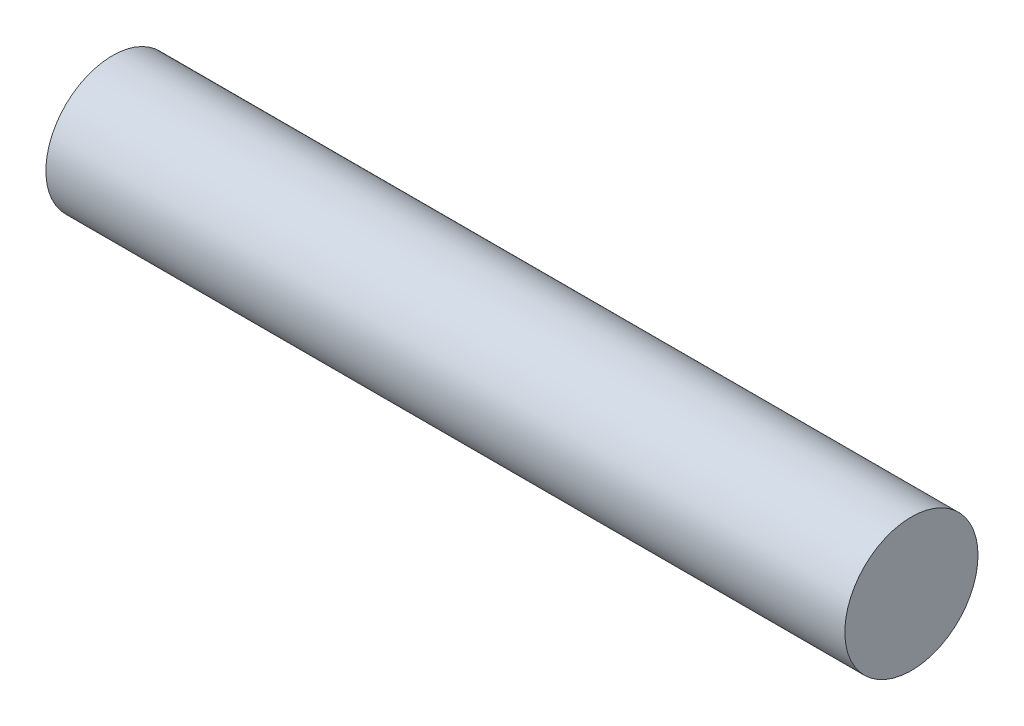
ISO-10303-21;
HEADER;
FILE_DESCRIPTION(('STEP AP214'),'2;1');
FILE_NAME('part.step','',(''),(''),'','','');
FILE_SCHEMA(('AUTOMOTIVE_DESIGN { 1 0 10303 214 1 1 1 1 }'));
ENDSEC;
DATA;
#1=APPLICATION_CONTEXT('core data for automotive mechanical design processes');
#2=APPLICATION_PROTOCOL_DEFINITION('international standard','automotive_design',2000,#1);
#3=PRODUCT_CONTEXT('',#1,'mechanical');
#4=PRODUCT('Part','Part','',(#3));
#5=PRODUCT_RELATED_PRODUCT_CATEGORY('part','',(#4));
#6=PRODUCT_DEFINITION_FORMATION('','',#4);
#7=PRODUCT_DEFINITION_CONTEXT('part definition',#1,'design');
#8=PRODUCT_DEFINITION('design','',#6,#7);
#9=PRODUCT_DEFINITION_SHAPE('','',#8);
#10=(LENGTH_UNIT() NAMED_UNIT(*) SI_UNIT(.MILLI.,.METRE.));
#11=(NAMED_UNIT(*) PLANE_ANGLE_UNIT() SI_UNIT($,.RADIAN.));
#12=(NAMED_UNIT(*) SI_UNIT($,.STERADIAN.) SOLID_ANGLE_UNIT());
#13=UNCERTAINTY_MEASURE_WITH_UNIT(LENGTH_MEASURE(1.E-05),#10,'distance_accuracy_value','');
#14=(GEOMETRIC_REPRESENTATION_CONTEXT(3) GLOBAL_UNCERTAINTY_ASSIGNED_CONTEXT((#13)) GLOBAL_UNIT_ASSIGNED_CONTEXT((#10,
#11,#12)) REPRESENTATION_CONTEXT('',''));
#15=CARTESIAN_POINT('',(0.,0.,0.));
#16=DIRECTION('',(0.,0.,1.));
#17=DIRECTION('',(1.,0.,0.));
#18=AXIS2_PLACEMENT_3D('',#15,#16,#17);
#19=CARTESIAN_POINT('',(300.,15.1529379760609,68.1918525281257));
#20=DIRECTION('',(-1.,0.,0.));
#21=DIRECTION('',(0.,0.,1.));
#22=AXIS2_PLACEMENT_3D('',#19,#20,#21);
#23=CYLINDRICAL_SURFACE('',#22,25.);
#24=CARTESIAN_POINT('',(300.,15.1529379760609,68.1918525281257));
#25=DIRECTION('',(1.,0.,0.));
#26=DIRECTION('',(0.,0.,-1.));
#27=AXIS2_PLACEMENT_3D('',#24,#25,#26);
#28=CIRCLE('',#27,25.);
#29=CARTESIAN_POINT('',(300.,15.1529379760609,43.1918525281257));
#30=VERTEX_POINT('',#29);
#31=EDGE_CURVE('E10',#30,#30,#28,.T.);
#32=ORIENTED_EDGE('',*,*,#31,.F.);
#33=EDGE_LOOP('',(#32));
#34=FACE_BOUND('',#33,.T.);
#35=CARTESIAN_POINT('',(0.,15.1529379760609,68.1918525281257));
#36=DIRECTION('',(1.,0.,0.));
#37=DIRECTION('',(0.,0.,-1.));
#38=AXIS2_PLACEMENT_3D('',#35,#36,#37);
#39=CIRCLE('',#38,25.);
#40=CARTESIAN_POINT('',(0.,15.1529379760609,43.1918525281257));
#41=VERTEX_POINT('',#40);
#42=EDGE_CURVE('E35',#41,#41,#39,.T.);
#43=ORIENTED_EDGE('',*,*,#42,.T.);
#44=EDGE_LOOP('',(#43));
#45=FACE_BOUND('',#44,.T.);
#46=ADVANCED_FACE('F32',(#34,#45),#23,.T.);
#47=CARTESIAN_POINT('',(300.,15.1529379760609,68.1918525281257));
#48=DIRECTION('',(1.,0.,0.));
#49=DIRECTION('',(0.,0.,-1.));
#50=AXIS2_PLACEMENT_3D('',#47,#48,#49);
#51=PLANE('',#50);
#52=ORIENTED_EDGE('',*,*,#31,.T.);
#53=EDGE_LOOP('',(#52));
#54=FACE_BOUND('',#53,.T.);
#55=ADVANCED_FACE('F47',(#54),#51,.T.);
#56=CARTESIAN_POINT('',(0.,15.1529379760609,68.1918525281257));
#57=DIRECTION('',(1.,0.,0.));
#58=DIRECTION('',(0.,0.,-1.));
#59=AXIS2_PLACEMENT_3D('',#56,#57,#58);
#60=PLANE('',#59);
#61=ORIENTED_EDGE('',*,*,#42,.F.);
#62=EDGE_LOOP('',(#61));
#63=FACE_BOUND('',#62,.T.);
#64=ADVANCED_FACE('F45',(#63),#60,.F.);
#65=CLOSED_SHELL('',(#46,#55,#64));
#66=MANIFOLD_SOLID_BREP('B2',#65);
#67=ADVANCED_BREP_SHAPE_REPRESENTATION('',(#18,#66),#14);
#68=SHAPE_DEFINITION_REPRESENTATION(#9,#67);
ENDSEC;
END-ISO-10303-21;
